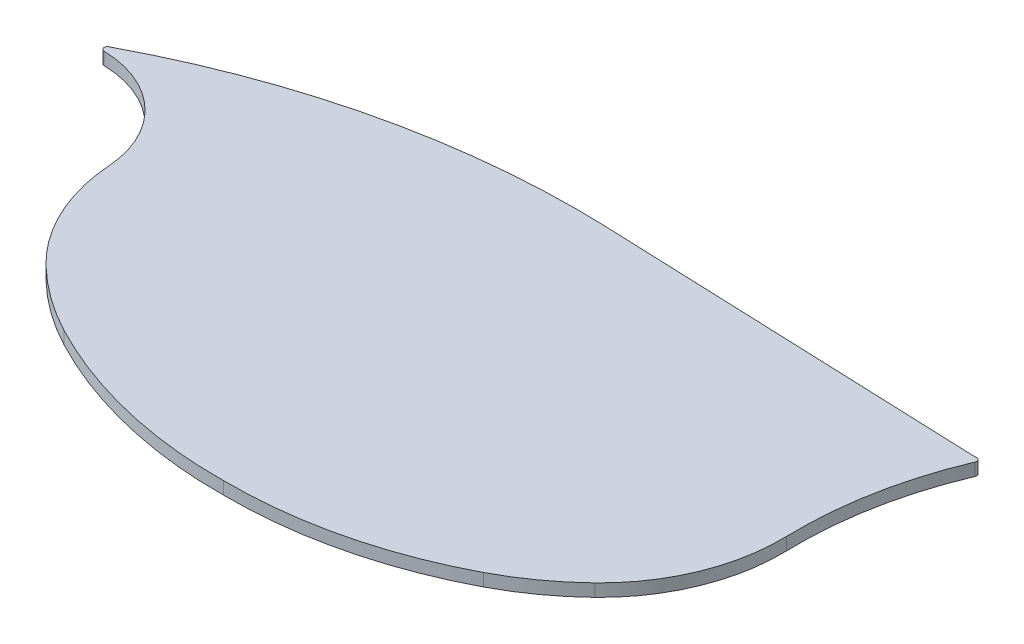
ISO-10303-21;
HEADER;
FILE_DESCRIPTION(('STEP AP214'),'2;1');
FILE_NAME('part.step','',(''),(''),'','','');
FILE_SCHEMA(('AUTOMOTIVE_DESIGN { 1 0 10303 214 1 1 1 1 }'));
ENDSEC;
DATA;
#1=APPLICATION_CONTEXT('core data for automotive mechanical design processes');
#2=APPLICATION_PROTOCOL_DEFINITION('international standard','automotive_design',2000,#1);
#3=PRODUCT_CONTEXT('',#1,'mechanical');
#4=PRODUCT('Part','Part','',(#3));
#5=PRODUCT_RELATED_PRODUCT_CATEGORY('part','',(#4));
#6=PRODUCT_DEFINITION_FORMATION('','',#4);
#7=PRODUCT_DEFINITION_CONTEXT('part definition',#1,'design');
#8=PRODUCT_DEFINITION('design','',#6,#7);
#9=PRODUCT_DEFINITION_SHAPE('','',#8);
#10=(LENGTH_UNIT() NAMED_UNIT(*) SI_UNIT(.MILLI.,.METRE.));
#11=(NAMED_UNIT(*) PLANE_ANGLE_UNIT() SI_UNIT($,.RADIAN.));
#12=(NAMED_UNIT(*) SI_UNIT($,.STERADIAN.) SOLID_ANGLE_UNIT());
#13=UNCERTAINTY_MEASURE_WITH_UNIT(LENGTH_MEASURE(1.E-05),#10,'distance_accuracy_value','');
#14=(GEOMETRIC_REPRESENTATION_CONTEXT(3) GLOBAL_UNCERTAINTY_ASSIGNED_CONTEXT((#13)) GLOBAL_UNIT_ASSIGNED_CONTEXT((#10,
#11,#12)) REPRESENTATION_CONTEXT('',''));
#15=CARTESIAN_POINT('',(0.,0.,0.));
#16=DIRECTION('',(0.,0.,1.));
#17=DIRECTION('',(1.,0.,0.));
#18=AXIS2_PLACEMENT_3D('',#15,#16,#17);
#19=CARTESIAN_POINT('',(27.3316086241781,3.,126.813102283368));
#20=DIRECTION('',(0.,-1.,0.));
#21=DIRECTION('',(0.,0.,-1.));
#22=AXIS2_PLACEMENT_3D('',#19,#20,#21);
#23=CYLINDRICAL_SURFACE('',#22,191.151856946376);
#24=CARTESIAN_POINT('',(27.3316086241781,0.,126.813102283368));
#25=DIRECTION('',(0.,1.,0.));
#26=DIRECTION('',(0.,0.,1.));
#27=AXIS2_PLACEMENT_3D('',#24,#25,#26);
#28=CIRCLE('',#27,191.151856946376);
#29=CARTESIAN_POINT('',(34.689006476965,0.,-64.1971097757884));
#30=VERTEX_POINT('',#29);
#31=CARTESIAN_POINT('',(-62.051503829736,0.,-42.1534376649274));
#32=VERTEX_POINT('',#31);
#33=EDGE_CURVE('E173',#30,#32,#28,.T.);
#34=ORIENTED_EDGE('',*,*,#33,.T.);
#35=DIRECTION('',(0.,-1.,0.));
#36=VECTOR('',#35,1.);
#37=CARTESIAN_POINT('',(-62.051503829736,3.,-42.1534376649274));
#38=LINE('',#37,#36);
#39=CARTESIAN_POINT('',(-62.051503829736,3.,-42.1534376649274));
#40=VERTEX_POINT('',#39);
#41=EDGE_CURVE('E11',#40,#32,#38,.T.);
#42=ORIENTED_EDGE('',*,*,#41,.F.);
#43=CARTESIAN_POINT('',(27.3316086241781,3.,126.813102283368));
#44=DIRECTION('',(0.,1.,0.));
#45=DIRECTION('',(0.,0.,1.));
#46=AXIS2_PLACEMENT_3D('',#43,#44,#45);
#47=CIRCLE('',#46,191.151856946376);
#48=CARTESIAN_POINT('',(34.689006476965,3.,-64.1971097757884));
#49=VERTEX_POINT('',#48);
#50=EDGE_CURVE('E210',#49,#40,#47,.T.);
#51=ORIENTED_EDGE('',*,*,#50,.F.);
#52=DIRECTION('',(0.,-1.,0.));
#53=VECTOR('',#52,1.);
#54=CARTESIAN_POINT('',(34.689006476965,3.,-64.1971097757884));
#55=LINE('',#54,#53);
#56=EDGE_CURVE('E169',#49,#30,#55,.T.);
#57=ORIENTED_EDGE('',*,*,#56,.T.);
#58=EDGE_LOOP('',(#34,#42,#51,#57));
#59=FACE_BOUND('',#58,.T.);
#60=ADVANCED_FACE('F42',(#59),#23,.T.);
#61=CARTESIAN_POINT('',(-61.853252726577,3.,-41.3783915372055));
#62=DIRECTION('',(0.,-1.,0.));
#63=DIRECTION('',(0.,0.,-1.));
#64=AXIS2_PLACEMENT_3D('',#61,#62,#63);
#65=CYLINDRICAL_SURFACE('',#64,0.800000000000359);
#66=CARTESIAN_POINT('',(-61.853252726577,0.,-41.3783915372055));
#67=DIRECTION('',(0.,1.,0.));
#68=DIRECTION('',(0.,0.,1.));
#69=AXIS2_PLACEMENT_3D('',#66,#67,#68);
#70=CIRCLE('',#69,0.800000000000359);
#71=CARTESIAN_POINT('',(-61.8693882212617,0.,-40.5785542751256));
#72=VERTEX_POINT('',#71);
#73=EDGE_CURVE('E177',#32,#72,#70,.T.);
#74=ORIENTED_EDGE('',*,*,#73,.T.);
#75=DIRECTION('',(0.,-1.,0.));
#76=VECTOR('',#75,1.);
#77=CARTESIAN_POINT('',(-61.8693882212617,3.,-40.5785542751256));
#78=LINE('',#77,#76);
#79=CARTESIAN_POINT('',(-61.8693882212617,3.,-40.5785542751256));
#80=VERTEX_POINT('',#79);
#81=EDGE_CURVE('E51',#80,#72,#78,.T.);
#82=ORIENTED_EDGE('',*,*,#81,.F.);
#83=CARTESIAN_POINT('',(-61.853252726577,3.,-41.3783915372055));
#84=DIRECTION('',(0.,1.,0.));
#85=DIRECTION('',(0.,0.,1.));
#86=AXIS2_PLACEMENT_3D('',#83,#84,#85);
#87=CIRCLE('',#86,0.800000000000359);
#88=EDGE_CURVE('E117',#40,#80,#87,.T.);
#89=ORIENTED_EDGE('',*,*,#88,.F.);
#90=ORIENTED_EDGE('',*,*,#41,.T.);
#91=EDGE_LOOP('',(#74,#82,#89,#90));
#92=FACE_BOUND('',#91,.T.);
#93=ADVANCED_FACE('F311',(#92),#65,.T.);
#94=CARTESIAN_POINT('',(-62.3702027815755,3.,-15.7531519829182));
#95=DIRECTION('',(0.,-1.,0.));
#96=DIRECTION('',(0.,0.,-1.));
#97=AXIS2_PLACEMENT_3D('',#94,#95,#96);
#98=CYLINDRICAL_SURFACE('',#97,24.8304533626304);
#99=CARTESIAN_POINT('',(-62.3702027815755,0.,-15.7531519829182));
#100=DIRECTION('',(0.,-1.,0.));
#101=DIRECTION('',(0.,0.,1.));
#102=AXIS2_PLACEMENT_3D('',#99,#100,#101);
#103=CIRCLE('',#102,24.8304533626304);
#104=CARTESIAN_POINT('',(-37.6012672406868,0.,-17.4999336994081));
#105=VERTEX_POINT('',#104);
#106=EDGE_CURVE('E180',#72,#105,#103,.T.);
#107=ORIENTED_EDGE('',*,*,#106,.T.);
#108=DIRECTION('',(0.,-1.,0.));
#109=VECTOR('',#108,1.);
#110=CARTESIAN_POINT('',(-37.6012672406868,3.,-17.4999336994081));
#111=LINE('',#110,#109);
#112=CARTESIAN_POINT('',(-37.6012672406868,3.,-17.4999336994081));
#113=VERTEX_POINT('',#112);
#114=EDGE_CURVE('E241',#113,#105,#111,.T.);
#115=ORIENTED_EDGE('',*,*,#114,.F.);
#116=CARTESIAN_POINT('',(-62.3702027815755,3.,-15.7531519829182));
#117=DIRECTION('',(0.,-1.,0.));
#118=DIRECTION('',(0.,0.,1.));
#119=AXIS2_PLACEMENT_3D('',#116,#117,#118);
#120=CIRCLE('',#119,24.8304533626304);
#121=EDGE_CURVE('E251',#80,#113,#120,.T.);
#122=ORIENTED_EDGE('',*,*,#121,.F.);
#123=ORIENTED_EDGE('',*,*,#81,.T.);
#124=EDGE_LOOP('',(#107,#115,#122,#123));
#125=FACE_BOUND('',#124,.T.);
#126=ADVANCED_FACE('F249',(#125),#98,.F.);
#127=CARTESIAN_POINT('',(5.8076299621264,3.,-20.5612629939882));
#128=DIRECTION('',(0.,-1.,0.));
#129=DIRECTION('',(0.,0.,-1.));
#130=AXIS2_PLACEMENT_3D('',#127,#128,#129);
#131=CYLINDRICAL_SURFACE('',#130,43.5167105077378);
#132=CARTESIAN_POINT('',(5.8076299621264,0.,-20.5612629939882));
#133=DIRECTION('',(0.,1.,0.));
#134=DIRECTION('',(0.,0.,1.));
#135=AXIS2_PLACEMENT_3D('',#132,#133,#134);
#136=CIRCLE('',#135,43.5167105077378);
#137=CARTESIAN_POINT('',(-24.4126766417821,0.,10.7506702293059));
#138=VERTEX_POINT('',#137);
#139=EDGE_CURVE('E183',#105,#138,#136,.T.);
#140=ORIENTED_EDGE('',*,*,#139,.T.);
#141=DIRECTION('',(0.,-1.,0.));
#142=VECTOR('',#141,1.);
#143=CARTESIAN_POINT('',(-24.4126766417821,3.,10.7506702293059));
#144=LINE('',#143,#142);
#145=CARTESIAN_POINT('',(-24.4126766417821,3.,10.7506702293059));
#146=VERTEX_POINT('',#145);
#147=EDGE_CURVE('E237',#146,#138,#144,.T.);
#148=ORIENTED_EDGE('',*,*,#147,.F.);
#149=CARTESIAN_POINT('',(5.8076299621264,3.,-20.5612629939882));
#150=DIRECTION('',(0.,1.,0.));
#151=DIRECTION('',(0.,0.,1.));
#152=AXIS2_PLACEMENT_3D('',#149,#150,#151);
#153=CIRCLE('',#152,43.5167105077378);
#154=EDGE_CURVE('E270',#113,#146,#153,.T.);
#155=ORIENTED_EDGE('',*,*,#154,.F.);
#156=ORIENTED_EDGE('',*,*,#114,.T.);
#157=EDGE_LOOP('',(#140,#148,#155,#156));
#158=FACE_BOUND('',#157,.T.);
#159=ADVANCED_FACE('F260',(#158),#131,.T.);
#160=CARTESIAN_POINT('',(22.2518508532743,3.,-37.5994867685333));
#161=DIRECTION('',(0.,-1.,0.));
#162=DIRECTION('',(0.,0.,-1.));
#163=AXIS2_PLACEMENT_3D('',#160,#161,#162);
#164=CYLINDRICAL_SURFACE('',#163,67.1960996491059);
#165=CARTESIAN_POINT('',(22.2518508532743,0.,-37.5994867685333));
#166=DIRECTION('',(0.,1.,0.));
#167=DIRECTION('',(0.,0.,1.));
#168=AXIS2_PLACEMENT_3D('',#165,#166,#167);
#169=CIRCLE('',#168,67.1960996491059);
#170=CARTESIAN_POINT('',(-8.97223188191198,0.,21.9015423435655));
#171=VERTEX_POINT('',#170);
#172=EDGE_CURVE('E186',#138,#171,#169,.T.);
#173=ORIENTED_EDGE('',*,*,#172,.T.);
#174=DIRECTION('',(0.,-1.,0.));
#175=VECTOR('',#174,1.);
#176=CARTESIAN_POINT('',(-8.97223188191198,3.,21.9015423435655));
#177=LINE('',#176,#175);
#178=CARTESIAN_POINT('',(-8.97223188191198,3.,21.9015423435655));
#179=VERTEX_POINT('',#178);
#180=EDGE_CURVE('E233',#179,#171,#177,.T.);
#181=ORIENTED_EDGE('',*,*,#180,.F.);
#182=CARTESIAN_POINT('',(22.2518508532743,3.,-37.5994867685333));
#183=DIRECTION('',(0.,1.,0.));
#184=DIRECTION('',(0.,0.,1.));
#185=AXIS2_PLACEMENT_3D('',#182,#183,#184);
#186=CIRCLE('',#185,67.1960996491059);
#187=EDGE_CURVE('E266',#146,#179,#186,.T.);
#188=ORIENTED_EDGE('',*,*,#187,.F.);
#189=ORIENTED_EDGE('',*,*,#147,.T.);
#190=EDGE_LOOP('',(#173,#181,#188,#189));
#191=FACE_BOUND('',#190,.T.);
#192=ADVANCED_FACE('F264',(#191),#164,.T.);
#193=CARTESIAN_POINT('',(39.9254016709495,3.,-71.2784412677026));
#194=DIRECTION('',(0.,-1.,0.));
#195=DIRECTION('',(0.,0.,-1.));
#196=AXIS2_PLACEMENT_3D('',#193,#194,#195);
#197=CYLINDRICAL_SURFACE('',#196,105.230641511235);
#198=CARTESIAN_POINT('',(39.9254016709495,0.,-71.2784412677026));
#199=DIRECTION('',(0.,1.,0.));
#200=DIRECTION('',(0.,0.,1.));
#201=AXIS2_PLACEMENT_3D('',#198,#199,#200);
#202=CIRCLE('',#201,105.230641511235);
#203=CARTESIAN_POINT('',(41.132426556438,0.,33.9452775593372));
#204=VERTEX_POINT('',#203);
#205=EDGE_CURVE('E189',#171,#204,#202,.T.);
#206=ORIENTED_EDGE('',*,*,#205,.T.);
#207=DIRECTION('',(0.,-1.,0.));
#208=VECTOR('',#207,1.);
#209=CARTESIAN_POINT('',(41.132426556438,3.,33.9452775593372));
#210=LINE('',#209,#208);
#211=CARTESIAN_POINT('',(41.132426556438,3.,33.9452775593372));
#212=VERTEX_POINT('',#211);
#213=EDGE_CURVE('E229',#212,#204,#210,.T.);
#214=ORIENTED_EDGE('',*,*,#213,.F.);
#215=CARTESIAN_POINT('',(39.9254016709495,3.,-71.2784412677026));
#216=DIRECTION('',(0.,1.,0.));
#217=DIRECTION('',(0.,0.,1.));
#218=AXIS2_PLACEMENT_3D('',#215,#216,#217);
#219=CIRCLE('',#218,105.230641511235);
#220=EDGE_CURVE('E269',#179,#212,#219,.T.);
#221=ORIENTED_EDGE('',*,*,#220,.F.);
#222=ORIENTED_EDGE('',*,*,#180,.T.);
#223=EDGE_LOOP('',(#206,#214,#221,#222));
#224=FACE_BOUND('',#223,.T.);
#225=ADVANCED_FACE('F324',(#224),#197,.T.);
#226=CARTESIAN_POINT('',(42.3394514419267,3.,-71.2784412677026));
#227=DIRECTION('',(0.,-1.,0.));
#228=DIRECTION('',(0.,0.,-1.));
#229=AXIS2_PLACEMENT_3D('',#226,#227,#228);
#230=CYLINDRICAL_SURFACE('',#229,105.230641511235);
#231=CARTESIAN_POINT('',(42.3394514419267,0.,-71.2784412677026));
#232=DIRECTION('',(0.,1.,0.));
#233=DIRECTION('',(0.,0.,1.));
#234=AXIS2_PLACEMENT_3D('',#231,#232,#233);
#235=CIRCLE('',#234,105.230641511235);
#236=CARTESIAN_POINT('',(91.2370849947881,0.,21.9015423435655));
#237=VERTEX_POINT('',#236);
#238=EDGE_CURVE('E192',#204,#237,#235,.T.);
#239=ORIENTED_EDGE('',*,*,#238,.T.);
#240=DIRECTION('',(0.,-1.,0.));
#241=VECTOR('',#240,1.);
#242=CARTESIAN_POINT('',(91.2370849947881,3.,21.9015423435655));
#243=LINE('',#242,#241);
#244=CARTESIAN_POINT('',(91.2370849947881,3.,21.9015423435655));
#245=VERTEX_POINT('',#244);
#246=EDGE_CURVE('E225',#245,#237,#243,.T.);
#247=ORIENTED_EDGE('',*,*,#246,.F.);
#248=CARTESIAN_POINT('',(42.3394514419267,3.,-71.2784412677026));
#249=DIRECTION('',(0.,1.,0.));
#250=DIRECTION('',(0.,0.,1.));
#251=AXIS2_PLACEMENT_3D('',#248,#249,#250);
#252=CIRCLE('',#251,105.230641511235);
#253=EDGE_CURVE('E274',#212,#245,#252,.T.);
#254=ORIENTED_EDGE('',*,*,#253,.F.);
#255=ORIENTED_EDGE('',*,*,#213,.T.);
#256=EDGE_LOOP('',(#239,#247,#254,#255));
#257=FACE_BOUND('',#256,.T.);
#258=ADVANCED_FACE('F327',(#257),#230,.T.);
#259=CARTESIAN_POINT('',(60.0130022596012,3.,-37.5994867685342));
#260=DIRECTION('',(0.,-1.,0.));
#261=DIRECTION('',(0.,0.,-1.));
#262=AXIS2_PLACEMENT_3D('',#259,#260,#261);
#263=CYLINDRICAL_SURFACE('',#262,67.1960996491071);
#264=CARTESIAN_POINT('',(60.0130022596012,0.,-37.5994867685342));
#265=DIRECTION('',(0.,1.,0.));
#266=DIRECTION('',(0.,0.,1.));
#267=AXIS2_PLACEMENT_3D('',#264,#265,#266);
#268=CIRCLE('',#267,67.1960996491071);
#269=CARTESIAN_POINT('',(106.677529754658,0.,10.750670229306));
#270=VERTEX_POINT('',#269);
#271=EDGE_CURVE('E195',#237,#270,#268,.T.);
#272=ORIENTED_EDGE('',*,*,#271,.T.);
#273=DIRECTION('',(0.,-1.,0.));
#274=VECTOR('',#273,1.);
#275=CARTESIAN_POINT('',(106.677529754658,3.,10.750670229306));
#276=LINE('',#275,#274);
#277=CARTESIAN_POINT('',(106.677529754658,3.,10.750670229306));
#278=VERTEX_POINT('',#277);
#279=EDGE_CURVE('E221',#278,#270,#276,.T.);
#280=ORIENTED_EDGE('',*,*,#279,.F.);
#281=CARTESIAN_POINT('',(60.0130022596012,3.,-37.5994867685342));
#282=DIRECTION('',(0.,1.,0.));
#283=DIRECTION('',(0.,0.,1.));
#284=AXIS2_PLACEMENT_3D('',#281,#282,#283);
#285=CIRCLE('',#284,67.1960996491071);
#286=EDGE_CURVE('E281',#245,#278,#285,.T.);
#287=ORIENTED_EDGE('',*,*,#286,.F.);
#288=ORIENTED_EDGE('',*,*,#246,.T.);
#289=EDGE_LOOP('',(#272,#280,#287,#288));
#290=FACE_BOUND('',#289,.T.);
#291=ADVANCED_FACE('F331',(#290),#263,.T.);
#292=CARTESIAN_POINT('',(76.5169839217451,3.,-20.4993435272112));
#293=DIRECTION('',(0.,-1.,0.));
#294=DIRECTION('',(0.,0.,-1.));
#295=AXIS2_PLACEMENT_3D('',#292,#293,#294);
#296=CYLINDRICAL_SURFACE('',#295,43.4306560475636);
#297=CARTESIAN_POINT('',(76.5169839217451,0.,-20.4993435272112));
#298=DIRECTION('',(0.,1.,0.));
#299=DIRECTION('',(0.,0.,1.));
#300=AXIS2_PLACEMENT_3D('',#297,#298,#299);
#301=CIRCLE('',#300,43.4306560475636);
#302=CARTESIAN_POINT('',(119.930653965402,0.,-21.7138961453515));
#303=VERTEX_POINT('',#302);
#304=EDGE_CURVE('E198',#270,#303,#301,.T.);
#305=ORIENTED_EDGE('',*,*,#304,.T.);
#306=DIRECTION('',(0.,-1.,0.));
#307=VECTOR('',#306,1.);
#308=CARTESIAN_POINT('',(119.930653965402,3.,-21.7138961453515));
#309=LINE('',#308,#307);
#310=CARTESIAN_POINT('',(119.930653965402,3.,-21.7138961453515));
#311=VERTEX_POINT('',#310);
#312=EDGE_CURVE('E217',#311,#303,#309,.T.);
#313=ORIENTED_EDGE('',*,*,#312,.F.);
#314=CARTESIAN_POINT('',(76.5169839217451,3.,-20.4993435272112));
#315=DIRECTION('',(0.,1.,0.));
#316=DIRECTION('',(0.,0.,1.));
#317=AXIS2_PLACEMENT_3D('',#314,#315,#316);
#318=CIRCLE('',#317,43.4306560475636);
#319=EDGE_CURVE('E284',#278,#311,#318,.T.);
#320=ORIENTED_EDGE('',*,*,#319,.F.);
#321=ORIENTED_EDGE('',*,*,#279,.T.);
#322=EDGE_LOOP('',(#305,#313,#320,#321));
#323=FACE_BOUND('',#322,.T.);
#324=ADVANCED_FACE('F292',(#323),#296,.T.);
#325=CARTESIAN_POINT('',(210.859542491517,3.,-24.2577474141551));
#326=DIRECTION('',(0.,-1.,0.));
#327=DIRECTION('',(0.,0.,-1.));
#328=AXIS2_PLACEMENT_3D('',#325,#326,#327);
#329=CYLINDRICAL_SURFACE('',#328,90.9644653030647);
#330=CARTESIAN_POINT('',(210.859542491517,0.,-24.2577474141551));
#331=DIRECTION('',(0.,-1.,0.));
#332=DIRECTION('',(0.,0.,1.));
#333=AXIS2_PLACEMENT_3D('',#330,#331,#332);
#334=CIRCLE('',#333,90.9644653030647);
#335=CARTESIAN_POINT('',(127.049993776456,0.,-59.6200648163029));
#336=VERTEX_POINT('',#335);
#337=EDGE_CURVE('E201',#303,#336,#334,.T.);
#338=ORIENTED_EDGE('',*,*,#337,.T.);
#339=DIRECTION('',(0.,-1.,0.));
#340=VECTOR('',#339,1.);
#341=CARTESIAN_POINT('',(127.049993776456,3.,-59.6200648163029));
#342=LINE('',#341,#340);
#343=CARTESIAN_POINT('',(127.049993776456,3.,-59.6200648163029));
#344=VERTEX_POINT('',#343);
#345=EDGE_CURVE('E162',#344,#336,#342,.T.);
#346=ORIENTED_EDGE('',*,*,#345,.F.);
#347=CARTESIAN_POINT('',(210.859542491517,3.,-24.2577474141551));
#348=DIRECTION('',(0.,-1.,0.));
#349=DIRECTION('',(0.,0.,1.));
#350=AXIS2_PLACEMENT_3D('',#347,#348,#349);
#351=CIRCLE('',#350,90.9644653030647);
#352=EDGE_CURVE('E151',#311,#344,#351,.T.);
#353=ORIENTED_EDGE('',*,*,#352,.F.);
#354=ORIENTED_EDGE('',*,*,#312,.T.);
#355=EDGE_LOOP('',(#338,#346,#353,#354));
#356=FACE_BOUND('',#355,.T.);
#357=ADVANCED_FACE('F296',(#356),#329,.F.);
#358=CARTESIAN_POINT('',(126.312918713698,3.,-59.9310637742748));
#359=DIRECTION('',(0.,-1.,0.));
#360=DIRECTION('',(0.,0.,-1.));
#361=AXIS2_PLACEMENT_3D('',#358,#359,#360);
#362=CYLINDRICAL_SURFACE('',#361,0.800000000000006);
#363=CARTESIAN_POINT('',(126.312918713698,0.,-59.9310637742748));
#364=DIRECTION('',(0.,1.,0.));
#365=DIRECTION('',(0.,0.,1.));
#366=AXIS2_PLACEMENT_3D('',#363,#364,#365);
#367=CIRCLE('',#366,0.800000000000006);
#368=CARTESIAN_POINT('',(126.242784376645,0.,-60.7279835787508));
#369=VERTEX_POINT('',#368);
#370=EDGE_CURVE('E160',#336,#369,#367,.T.);
#371=ORIENTED_EDGE('',*,*,#370,.T.);
#372=DIRECTION('',(0.,-1.,0.));
#373=VECTOR('',#372,1.);
#374=CARTESIAN_POINT('',(126.242784376645,3.,-60.7279835787508));
#375=LINE('',#374,#373);
#376=CARTESIAN_POINT('',(126.242784376645,3.,-60.7279835787508));
#377=VERTEX_POINT('',#376);
#378=EDGE_CURVE('E157',#377,#369,#375,.T.);
#379=ORIENTED_EDGE('',*,*,#378,.F.);
#380=CARTESIAN_POINT('',(126.312918713698,3.,-59.9310637742748));
#381=DIRECTION('',(0.,1.,0.));
#382=DIRECTION('',(0.,0.,1.));
#383=AXIS2_PLACEMENT_3D('',#380,#381,#382);
#384=CIRCLE('',#383,0.800000000000006);
#385=EDGE_CURVE('E145',#344,#377,#384,.T.);
#386=ORIENTED_EDGE('',*,*,#385,.F.);
#387=ORIENTED_EDGE('',*,*,#345,.T.);
#388=EDGE_LOOP('',(#371,#379,#386,#387));
#389=FACE_BOUND('',#388,.T.);
#390=ADVANCED_FACE('F158',(#389),#362,.T.);
#391=CARTESIAN_POINT('',(125.611575343166,3.,-67.9002618190418));
#392=DIRECTION('',(0.,-1.,0.));
#393=DIRECTION('',(0.,0.,-1.));
#394=AXIS2_PLACEMENT_3D('',#391,#392,#393);
#395=CYLINDRICAL_SURFACE('',#394,7.20000000000671);
#396=CARTESIAN_POINT('',(125.611575343166,0.,-67.9002618190418));
#397=DIRECTION('',(0.,-1.,0.));
#398=DIRECTION('',(0.,0.,1.));
#399=AXIS2_PLACEMENT_3D('',#396,#397,#398);
#400=CIRCLE('',#399,7.20000000000671);
#401=CARTESIAN_POINT('',(125.334448741383,0.,-60.7055970703074));
#402=VERTEX_POINT('',#401);
#403=EDGE_CURVE('E103',#369,#402,#400,.T.);
#404=ORIENTED_EDGE('',*,*,#403,.T.);
#405=DIRECTION('',(0.,-1.,0.));
#406=VECTOR('',#405,1.);
#407=CARTESIAN_POINT('',(125.334448741383,3.,-60.7055970703074));
#408=LINE('',#407,#406);
#409=CARTESIAN_POINT('',(125.334448741383,3.,-60.7055970703074));
#410=VERTEX_POINT('',#409);
#411=EDGE_CURVE('E163',#410,#402,#408,.T.);
#412=ORIENTED_EDGE('',*,*,#411,.F.);
#413=CARTESIAN_POINT('',(125.611575343166,3.,-67.9002618190418));
#414=DIRECTION('',(0.,-1.,0.));
#415=DIRECTION('',(0.,0.,1.));
#416=AXIS2_PLACEMENT_3D('',#413,#414,#415);
#417=CIRCLE('',#416,7.20000000000671);
#418=EDGE_CURVE('E149',#377,#410,#417,.T.);
#419=ORIENTED_EDGE('',*,*,#418,.F.);
#420=ORIENTED_EDGE('',*,*,#378,.T.);
#421=EDGE_LOOP('',(#404,#412,#419,#420));
#422=FACE_BOUND('',#421,.T.);
#423=ADVANCED_FACE('F165',(#422),#395,.F.);
#424=CARTESIAN_POINT('',(125.334448741383,3.,-60.7055970703074));
#425=DIRECTION('',(-0.0384898058031991,0.,0.999258992878839));
#426=DIRECTION('',(0.999258992878839,0.,0.0384898058031991));
#427=AXIS2_PLACEMENT_3D('',#424,#425,#426);
#428=PLANE('',#427);
#429=DIRECTION('',(-0.999258992878839,0.,-0.0384898058031991));
#430=VECTOR('',#429,1.);
#431=CARTESIAN_POINT('',(125.334448741383,0.,-60.7055970703074));
#432=LINE('',#431,#430);
#433=EDGE_CURVE('E109',#402,#30,#432,.T.);
#434=ORIENTED_EDGE('',*,*,#433,.T.);
#435=ORIENTED_EDGE('',*,*,#56,.F.);
#436=DIRECTION('',(-0.999258992878839,0.,-0.0384898058031991));
#437=VECTOR('',#436,1.);
#438=CARTESIAN_POINT('',(125.334448741383,3.,-60.7055970703074));
#439=LINE('',#438,#437);
#440=EDGE_CURVE('E59',#410,#49,#439,.T.);
#441=ORIENTED_EDGE('',*,*,#440,.F.);
#442=ORIENTED_EDGE('',*,*,#411,.T.);
#443=EDGE_LOOP('',(#434,#435,#441,#442));
#444=FACE_BOUND('',#443,.T.);
#445=ADVANCED_FACE('F300',(#444),#428,.F.);
#446=CARTESIAN_POINT('',(27.3316086241781,3.,126.813102283368));
#447=DIRECTION('',(0.,1.,0.));
#448=DIRECTION('',(0.,0.,1.));
#449=AXIS2_PLACEMENT_3D('',#446,#447,#448);
#450=PLANE('',#449);
#451=ORIENTED_EDGE('',*,*,#50,.T.);
#452=ORIENTED_EDGE('',*,*,#88,.T.);
#453=ORIENTED_EDGE('',*,*,#121,.T.);
#454=ORIENTED_EDGE('',*,*,#154,.T.);
#455=ORIENTED_EDGE('',*,*,#187,.T.);
#456=ORIENTED_EDGE('',*,*,#220,.T.);
#457=ORIENTED_EDGE('',*,*,#253,.T.);
#458=ORIENTED_EDGE('',*,*,#286,.T.);
#459=ORIENTED_EDGE('',*,*,#319,.T.);
#460=ORIENTED_EDGE('',*,*,#352,.T.);
#461=ORIENTED_EDGE('',*,*,#385,.T.);
#462=ORIENTED_EDGE('',*,*,#418,.T.);
#463=ORIENTED_EDGE('',*,*,#440,.T.);
#464=EDGE_LOOP('',(#451,#452,#453,#454,#455,#456,#457,#458,#459,#460,#461,#462,#463));
#465=FACE_BOUND('',#464,.T.);
#466=ADVANCED_FACE('F147',(#465),#450,.T.);
#467=CARTESIAN_POINT('',(27.3316086241781,0.,126.813102283368));
#468=DIRECTION('',(0.,1.,0.));
#469=DIRECTION('',(0.,0.,1.));
#470=AXIS2_PLACEMENT_3D('',#467,#468,#469);
#471=PLANE('',#470);
#472=ORIENTED_EDGE('',*,*,#33,.F.);
#473=ORIENTED_EDGE('',*,*,#433,.F.);
#474=ORIENTED_EDGE('',*,*,#403,.F.);
#475=ORIENTED_EDGE('',*,*,#370,.F.);
#476=ORIENTED_EDGE('',*,*,#337,.F.);
#477=ORIENTED_EDGE('',*,*,#304,.F.);
#478=ORIENTED_EDGE('',*,*,#271,.F.);
#479=ORIENTED_EDGE('',*,*,#238,.F.);
#480=ORIENTED_EDGE('',*,*,#205,.F.);
#481=ORIENTED_EDGE('',*,*,#172,.F.);
#482=ORIENTED_EDGE('',*,*,#139,.F.);
#483=ORIENTED_EDGE('',*,*,#106,.F.);
#484=ORIENTED_EDGE('',*,*,#73,.F.);
#485=EDGE_LOOP('',(#472,#473,#474,#475,#476,#477,#478,#479,#480,#481,#482,#483,#484));
#486=FACE_BOUND('',#485,.T.);
#487=ADVANCED_FACE('F255',(#486),#471,.F.);
#488=CLOSED_SHELL('',(#60,#93,#126,#159,#192,#225,#258,#291,#324,#357,#390,#423,#445,#466,#487));
#489=MANIFOLD_SOLID_BREP('B2',#488);
#490=ADVANCED_BREP_SHAPE_REPRESENTATION('',(#18,#489),#14);
#491=SHAPE_DEFINITION_REPRESENTATION(#9,#490);
ENDSEC;
END-ISO-10303-21;
